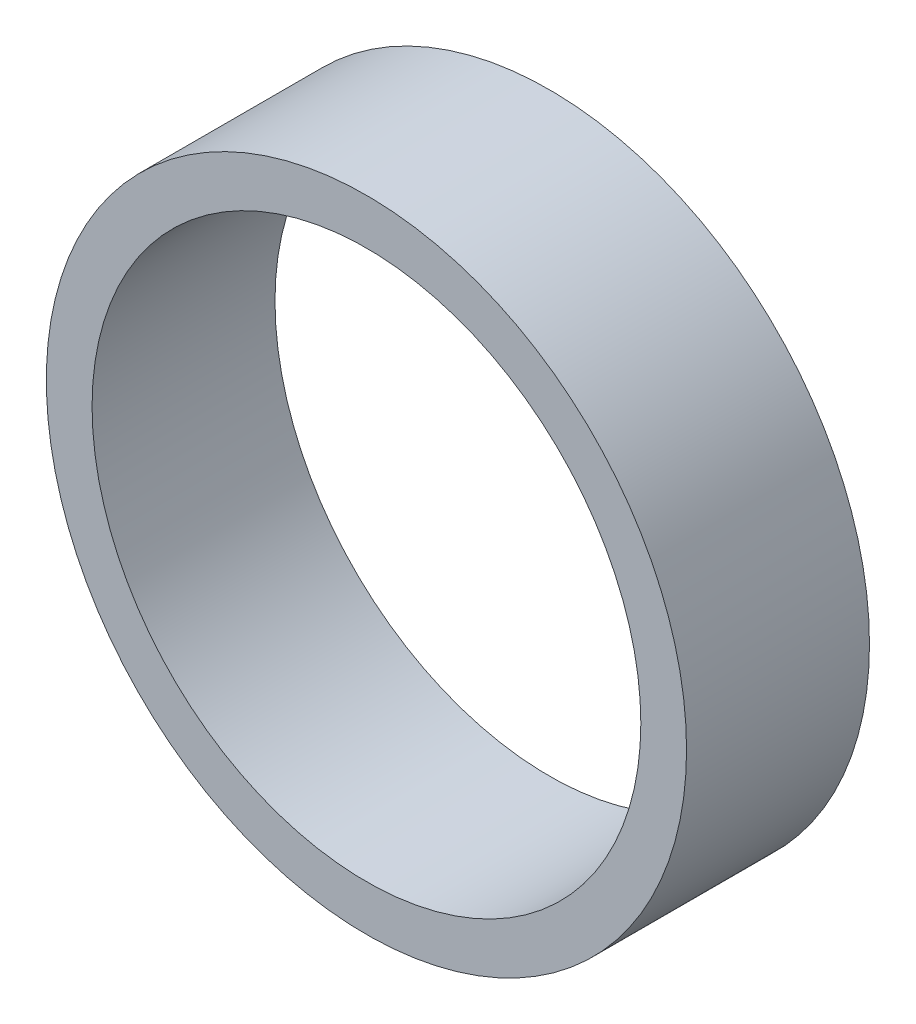
ISO-10303-21;
HEADER;
FILE_DESCRIPTION(('STEP AP214'),'2;1');
FILE_NAME('part.step','',(''),(''),'','','');
FILE_SCHEMA(('AUTOMOTIVE_DESIGN { 1 0 10303 214 1 1 1 1 }'));
ENDSEC;
DATA;
#1=APPLICATION_CONTEXT('core data for automotive mechanical design processes');
#2=APPLICATION_PROTOCOL_DEFINITION('international standard','automotive_design',2000,#1);
#3=PRODUCT_CONTEXT('',#1,'mechanical');
#4=PRODUCT('Part','Part','',(#3));
#5=PRODUCT_RELATED_PRODUCT_CATEGORY('part','',(#4));
#6=PRODUCT_DEFINITION_FORMATION('','',#4);
#7=PRODUCT_DEFINITION_CONTEXT('part definition',#1,'design');
#8=PRODUCT_DEFINITION('design','',#6,#7);
#9=PRODUCT_DEFINITION_SHAPE('','',#8);
#10=(LENGTH_UNIT() NAMED_UNIT(*) SI_UNIT(.MILLI.,.METRE.));
#11=(NAMED_UNIT(*) PLANE_ANGLE_UNIT() SI_UNIT($,.RADIAN.));
#12=(NAMED_UNIT(*) SI_UNIT($,.STERADIAN.) SOLID_ANGLE_UNIT());
#13=UNCERTAINTY_MEASURE_WITH_UNIT(LENGTH_MEASURE(1.E-05),#10,'distance_accuracy_value','');
#14=(GEOMETRIC_REPRESENTATION_CONTEXT(3) GLOBAL_UNCERTAINTY_ASSIGNED_CONTEXT((#13)) GLOBAL_UNIT_ASSIGNED_CONTEXT((#10,
#11,#12)) REPRESENTATION_CONTEXT('',''));
#15=CARTESIAN_POINT('',(0.,0.,0.));
#16=DIRECTION('',(0.,0.,1.));
#17=DIRECTION('',(1.,0.,0.));
#18=AXIS2_PLACEMENT_3D('',#15,#16,#17);
#19=CARTESIAN_POINT('',(0.,0.,20.));
#20=DIRECTION('',(0.,0.,1.));
#21=DIRECTION('',(1.,0.,0.));
#22=AXIS2_PLACEMENT_3D('',#19,#20,#21);
#23=PLANE('',#22);
#24=CARTESIAN_POINT('',(0.,0.,20.));
#25=DIRECTION('',(0.,0.,1.));
#26=DIRECTION('',(1.,0.,0.));
#27=AXIS2_PLACEMENT_3D('',#24,#25,#26);
#28=CIRCLE('',#27,70.);
#29=CARTESIAN_POINT('',(70.,0.,20.));
#30=VERTEX_POINT('',#29);
#31=EDGE_CURVE('E10',#30,#30,#28,.T.);
#32=ORIENTED_EDGE('',*,*,#31,.T.);
#33=EDGE_LOOP('',(#32));
#34=FACE_BOUND('',#33,.T.);
#35=CARTESIAN_POINT('',(0.,0.,20.));
#36=DIRECTION('',(0.,0.,1.));
#37=DIRECTION('',(1.,0.,0.));
#38=AXIS2_PLACEMENT_3D('',#35,#36,#37);
#39=CIRCLE('',#38,60.);
#40=CARTESIAN_POINT('',(60.,0.,20.));
#41=VERTEX_POINT('',#40);
#42=EDGE_CURVE('E44',#41,#41,#39,.T.);
#43=ORIENTED_EDGE('',*,*,#42,.F.);
#44=EDGE_LOOP('',(#43));
#45=FACE_BOUND('',#44,.T.);
#46=ADVANCED_FACE('F33',(#34,#45),#23,.T.);
#47=CARTESIAN_POINT('',(0.,0.,-20.));
#48=DIRECTION('',(0.,0.,1.));
#49=DIRECTION('',(1.,0.,0.));
#50=AXIS2_PLACEMENT_3D('',#47,#48,#49);
#51=PLANE('',#50);
#52=CARTESIAN_POINT('',(0.,0.,-20.));
#53=DIRECTION('',(0.,0.,1.));
#54=DIRECTION('',(1.,0.,0.));
#55=AXIS2_PLACEMENT_3D('',#52,#53,#54);
#56=CIRCLE('',#55,70.);
#57=CARTESIAN_POINT('',(70.,0.,-20.));
#58=VERTEX_POINT('',#57);
#59=EDGE_CURVE('E37',#58,#58,#56,.T.);
#60=ORIENTED_EDGE('',*,*,#59,.F.);
#61=EDGE_LOOP('',(#60));
#62=FACE_BOUND('',#61,.T.);
#63=CARTESIAN_POINT('',(0.,0.,-20.));
#64=DIRECTION('',(0.,0.,1.));
#65=DIRECTION('',(1.,0.,0.));
#66=AXIS2_PLACEMENT_3D('',#63,#64,#65);
#67=CIRCLE('',#66,60.);
#68=CARTESIAN_POINT('',(60.,0.,-20.));
#69=VERTEX_POINT('',#68);
#70=EDGE_CURVE('E46',#69,#69,#67,.T.);
#71=ORIENTED_EDGE('',*,*,#70,.T.);
#72=EDGE_LOOP('',(#71));
#73=FACE_BOUND('',#72,.T.);
#74=ADVANCED_FACE('F56',(#62,#73),#51,.F.);
#75=CARTESIAN_POINT('',(0.,0.,20.));
#76=DIRECTION('',(0.,0.,-1.));
#77=DIRECTION('',(-1.,0.,0.));
#78=AXIS2_PLACEMENT_3D('',#75,#76,#77);
#79=CYLINDRICAL_SURFACE('',#78,70.);
#80=ORIENTED_EDGE('',*,*,#31,.F.);
#81=EDGE_LOOP('',(#80));
#82=FACE_BOUND('',#81,.T.);
#83=ORIENTED_EDGE('',*,*,#59,.T.);
#84=EDGE_LOOP('',(#83));
#85=FACE_BOUND('',#84,.T.);
#86=ADVANCED_FACE('F35',(#82,#85),#79,.T.);
#87=CARTESIAN_POINT('',(0.,0.,20.));
#88=DIRECTION('',(0.,0.,-1.));
#89=DIRECTION('',(-1.,0.,0.));
#90=AXIS2_PLACEMENT_3D('',#87,#88,#89);
#91=CYLINDRICAL_SURFACE('',#90,60.);
#92=ORIENTED_EDGE('',*,*,#42,.T.);
#93=EDGE_LOOP('',(#92));
#94=FACE_BOUND('',#93,.T.);
#95=ORIENTED_EDGE('',*,*,#70,.F.);
#96=EDGE_LOOP('',(#95));
#97=FACE_BOUND('',#96,.T.);
#98=ADVANCED_FACE('F52',(#94,#97),#91,.F.);
#99=CLOSED_SHELL('',(#46,#74,#86,#98));
#100=MANIFOLD_SOLID_BREP('B2',#99);
#101=ADVANCED_BREP_SHAPE_REPRESENTATION('',(#18,#100),#14);
#102=SHAPE_DEFINITION_REPRESENTATION(#9,#101);
ENDSEC;
END-ISO-10303-21;
